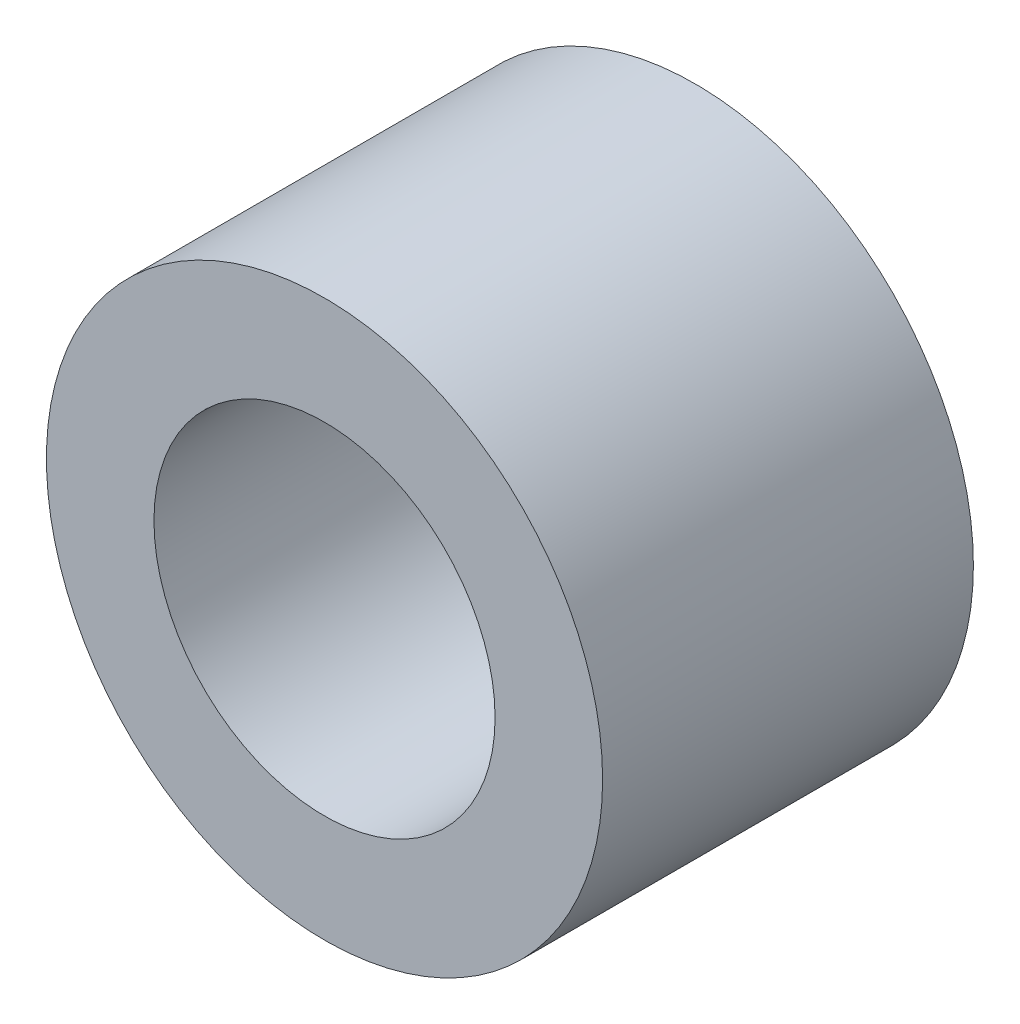
ISO-10303-21;
HEADER;
FILE_DESCRIPTION(('STEP AP214'),'2;1');
FILE_NAME('part.step','',(''),(''),'','','');
FILE_SCHEMA(('AUTOMOTIVE_DESIGN { 1 0 10303 214 1 1 1 1 }'));
ENDSEC;
DATA;
#1=APPLICATION_CONTEXT('core data for automotive mechanical design processes');
#2=APPLICATION_PROTOCOL_DEFINITION('international standard','automotive_design',2000,#1);
#3=PRODUCT_CONTEXT('',#1,'mechanical');
#4=PRODUCT('Part','Part','',(#3));
#5=PRODUCT_RELATED_PRODUCT_CATEGORY('part','',(#4));
#6=PRODUCT_DEFINITION_FORMATION('','',#4);
#7=PRODUCT_DEFINITION_CONTEXT('part definition',#1,'design');
#8=PRODUCT_DEFINITION('design','',#6,#7);
#9=PRODUCT_DEFINITION_SHAPE('','',#8);
#10=(LENGTH_UNIT() NAMED_UNIT(*) SI_UNIT(.MILLI.,.METRE.));
#11=(NAMED_UNIT(*) PLANE_ANGLE_UNIT() SI_UNIT($,.RADIAN.));
#12=(NAMED_UNIT(*) SI_UNIT($,.STERADIAN.) SOLID_ANGLE_UNIT());
#13=UNCERTAINTY_MEASURE_WITH_UNIT(LENGTH_MEASURE(1.E-05),#10,'distance_accuracy_value','');
#14=(GEOMETRIC_REPRESENTATION_CONTEXT(3) GLOBAL_UNCERTAINTY_ASSIGNED_CONTEXT((#13)) GLOBAL_UNIT_ASSIGNED_CONTEXT((#10,
#11,#12)) REPRESENTATION_CONTEXT('',''));
#15=CARTESIAN_POINT('',(0.,0.,0.));
#16=DIRECTION('',(0.,0.,1.));
#17=DIRECTION('',(1.,0.,0.));
#18=AXIS2_PLACEMENT_3D('',#15,#16,#17);
#19=CARTESIAN_POINT('',(0.,0.,1.5875));
#20=DIRECTION('',(0.,0.,1.));
#21=DIRECTION('',(1.,0.,0.));
#22=AXIS2_PLACEMENT_3D('',#19,#20,#21);
#23=PLANE('',#22);
#24=CARTESIAN_POINT('',(0.,0.,1.5875));
#25=DIRECTION('',(0.,0.,1.));
#26=DIRECTION('',(1.,0.,0.));
#27=AXIS2_PLACEMENT_3D('',#24,#25,#26);
#28=CIRCLE('',#27,2.38125);
#29=CARTESIAN_POINT('',(2.38125,0.,1.5875));
#30=VERTEX_POINT('',#29);
#31=EDGE_CURVE('E10',#30,#30,#28,.T.);
#32=ORIENTED_EDGE('',*,*,#31,.T.);
#33=EDGE_LOOP('',(#32));
#34=FACE_BOUND('',#33,.T.);
#35=CARTESIAN_POINT('',(0.,0.,1.5875));
#36=DIRECTION('',(0.,0.,1.));
#37=DIRECTION('',(1.,0.,0.));
#38=AXIS2_PLACEMENT_3D('',#35,#36,#37);
#39=CIRCLE('',#38,1.4605);
#40=CARTESIAN_POINT('',(1.4605,0.,1.5875));
#41=VERTEX_POINT('',#40);
#42=EDGE_CURVE('E49',#41,#41,#39,.T.);
#43=ORIENTED_EDGE('',*,*,#42,.F.);
#44=EDGE_LOOP('',(#43));
#45=FACE_BOUND('',#44,.T.);
#46=ADVANCED_FACE('F34',(#34,#45),#23,.T.);
#47=CARTESIAN_POINT('',(0.,0.,-1.5875));
#48=DIRECTION('',(0.,0.,1.));
#49=DIRECTION('',(1.,0.,0.));
#50=AXIS2_PLACEMENT_3D('',#47,#48,#49);
#51=PLANE('',#50);
#52=CARTESIAN_POINT('',(0.,0.,-1.5875));
#53=DIRECTION('',(0.,0.,1.));
#54=DIRECTION('',(1.,0.,0.));
#55=AXIS2_PLACEMENT_3D('',#52,#53,#54);
#56=CIRCLE('',#55,2.38125);
#57=CARTESIAN_POINT('',(2.38125,0.,-1.5875));
#58=VERTEX_POINT('',#57);
#59=EDGE_CURVE('E38',#58,#58,#56,.T.);
#60=ORIENTED_EDGE('',*,*,#59,.F.);
#61=EDGE_LOOP('',(#60));
#62=FACE_BOUND('',#61,.T.);
#63=CARTESIAN_POINT('',(0.,0.,-1.5875));
#64=DIRECTION('',(0.,0.,1.));
#65=DIRECTION('',(1.,0.,0.));
#66=AXIS2_PLACEMENT_3D('',#63,#64,#65);
#67=CIRCLE('',#66,1.4605);
#68=CARTESIAN_POINT('',(1.4605,0.,-1.5875));
#69=VERTEX_POINT('',#68);
#70=EDGE_CURVE('E51',#69,#69,#67,.T.);
#71=ORIENTED_EDGE('',*,*,#70,.T.);
#72=EDGE_LOOP('',(#71));
#73=FACE_BOUND('',#72,.T.);
#74=ADVANCED_FACE('F61',(#62,#73),#51,.F.);
#75=CARTESIAN_POINT('',(0.,0.,1.5875));
#76=DIRECTION('',(0.,0.,-1.));
#77=DIRECTION('',(-1.,0.,0.));
#78=AXIS2_PLACEMENT_3D('',#75,#76,#77);
#79=CYLINDRICAL_SURFACE('',#78,2.38125);
#80=ORIENTED_EDGE('',*,*,#31,.F.);
#81=EDGE_LOOP('',(#80));
#82=FACE_BOUND('',#81,.T.);
#83=ORIENTED_EDGE('',*,*,#59,.T.);
#84=EDGE_LOOP('',(#83));
#85=FACE_BOUND('',#84,.T.);
#86=ADVANCED_FACE('F36',(#82,#85),#79,.T.);
#87=CARTESIAN_POINT('',(0.,0.,1.5875));
#88=DIRECTION('',(0.,0.,-1.));
#89=DIRECTION('',(-1.,0.,0.));
#90=AXIS2_PLACEMENT_3D('',#87,#88,#89);
#91=CYLINDRICAL_SURFACE('',#90,1.4605);
#92=ORIENTED_EDGE('',*,*,#42,.T.);
#93=EDGE_LOOP('',(#92));
#94=FACE_BOUND('',#93,.T.);
#95=ORIENTED_EDGE('',*,*,#70,.F.);
#96=EDGE_LOOP('',(#95));
#97=FACE_BOUND('',#96,.T.);
#98=ADVANCED_FACE('F57',(#94,#97),#91,.F.);
#99=CLOSED_SHELL('',(#46,#74,#86,#98));
#100=MANIFOLD_SOLID_BREP('B2',#99);
#101=ADVANCED_BREP_SHAPE_REPRESENTATION('',(#18,#100),#14);
#102=SHAPE_DEFINITION_REPRESENTATION(#9,#101);
ENDSEC;
END-ISO-10303-21;
